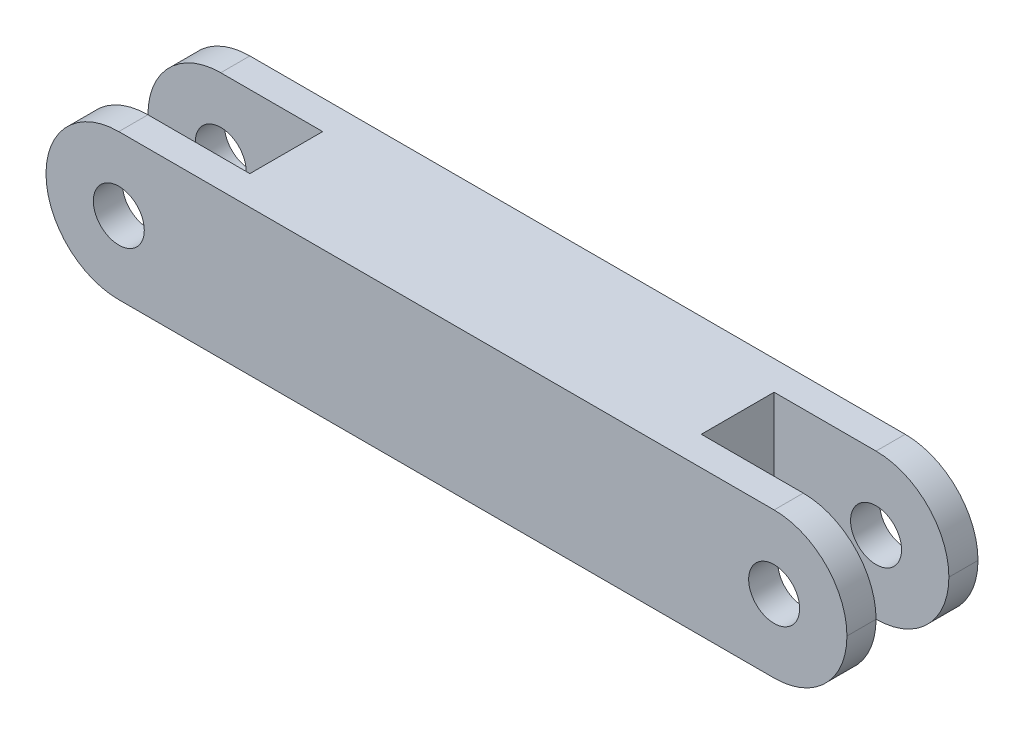
ISO-10303-21;
HEADER;
FILE_DESCRIPTION(('STEP AP214'),'2;1');
FILE_NAME('part.step','',(''),(''),'','','');
FILE_SCHEMA(('AUTOMOTIVE_DESIGN { 1 0 10303 214 1 1 1 1 }'));
ENDSEC;
DATA;
#1=APPLICATION_CONTEXT('core data for automotive mechanical design processes');
#2=APPLICATION_PROTOCOL_DEFINITION('international standard','automotive_design',2000,#1);
#3=PRODUCT_CONTEXT('',#1,'mechanical');
#4=PRODUCT('Part','Part','',(#3));
#5=PRODUCT_RELATED_PRODUCT_CATEGORY('part','',(#4));
#6=PRODUCT_DEFINITION_FORMATION('','',#4);
#7=PRODUCT_DEFINITION_CONTEXT('part definition',#1,'design');
#8=PRODUCT_DEFINITION('design','',#6,#7);
#9=PRODUCT_DEFINITION_SHAPE('','',#8);
#10=(LENGTH_UNIT() NAMED_UNIT(*) SI_UNIT(.MILLI.,.METRE.));
#11=(NAMED_UNIT(*) PLANE_ANGLE_UNIT() SI_UNIT($,.RADIAN.));
#12=(NAMED_UNIT(*) SI_UNIT($,.STERADIAN.) SOLID_ANGLE_UNIT());
#13=UNCERTAINTY_MEASURE_WITH_UNIT(LENGTH_MEASURE(1.E-05),#10,'distance_accuracy_value','');
#14=(GEOMETRIC_REPRESENTATION_CONTEXT(3) GLOBAL_UNCERTAINTY_ASSIGNED_CONTEXT((#13)) GLOBAL_UNIT_ASSIGNED_CONTEXT((#10,
#11,#12)) REPRESENTATION_CONTEXT('',''));
#15=CARTESIAN_POINT('',(0.,0.,0.));
#16=DIRECTION('',(0.,0.,1.));
#17=DIRECTION('',(1.,0.,0.));
#18=AXIS2_PLACEMENT_3D('',#15,#16,#17);
#19=CARTESIAN_POINT('',(50.,5.,0.));
#20=DIRECTION('',(0.,0.,1.));
#21=DIRECTION('',(1.,0.,0.));
#22=AXIS2_PLACEMENT_3D('',#19,#20,#21);
#23=CYLINDRICAL_SURFACE('',#22,5.);
#24=CARTESIAN_POINT('',(50.,5.,7.));
#25=DIRECTION('',(0.,0.,1.));
#26=DIRECTION('',(1.,0.,0.));
#27=AXIS2_PLACEMENT_3D('',#24,#25,#26);
#28=CIRCLE('',#27,5.);
#29=CARTESIAN_POINT('',(50.,10.,7.));
#30=VERTEX_POINT('',#29);
#31=CARTESIAN_POINT('',(55.,5.,7.));
#32=VERTEX_POINT('',#31);
#33=EDGE_CURVE('E215',#30,#32,#28,.F.);
#34=ORIENTED_EDGE('',*,*,#33,.F.);
#35=DIRECTION('',(0.,0.,-1.));
#36=VECTOR('',#35,1.);
#37=CARTESIAN_POINT('',(50.,10.,0.));
#38=LINE('',#37,#36);
#39=CARTESIAN_POINT('',(50.,10.,9.00000000000001));
#40=VERTEX_POINT('',#39);
#41=EDGE_CURVE('E276',#40,#30,#38,.T.);
#42=ORIENTED_EDGE('',*,*,#41,.F.);
#43=CARTESIAN_POINT('',(50.,5.,9.00000000000001));
#44=DIRECTION('',(0.,0.,-1.));
#45=DIRECTION('',(-1.,0.,0.));
#46=AXIS2_PLACEMENT_3D('',#43,#44,#45);
#47=CIRCLE('',#46,5.);
#48=CARTESIAN_POINT('',(55.,5.,9.00000000000001));
#49=VERTEX_POINT('',#48);
#50=EDGE_CURVE('E267',#49,#40,#47,.F.);
#51=ORIENTED_EDGE('',*,*,#50,.F.);
#52=DIRECTION('',(0.,0.,-1.));
#53=VECTOR('',#52,1.);
#54=CARTESIAN_POINT('',(55.,5.,9.00000000000001));
#55=LINE('',#54,#53);
#56=EDGE_CURVE('E281',#32,#49,#55,.F.);
#57=ORIENTED_EDGE('',*,*,#56,.F.);
#58=EDGE_LOOP('',(#34,#42,#51,#57));
#59=FACE_BOUND('',#58,.T.);
#60=ADVANCED_FACE('F43',(#59),#23,.T.);
#61=CARTESIAN_POINT('',(50.,5.,9.00000000000001));
#62=DIRECTION('',(0.,0.,-1.));
#63=DIRECTION('',(-1.,0.,0.));
#64=AXIS2_PLACEMENT_3D('',#61,#62,#63);
#65=CYLINDRICAL_SURFACE('',#64,5.);
#66=CARTESIAN_POINT('',(50.,5.,7.));
#67=DIRECTION('',(0.,0.,1.));
#68=DIRECTION('',(1.,0.,0.));
#69=AXIS2_PLACEMENT_3D('',#66,#67,#68);
#70=CIRCLE('',#69,5.);
#71=CARTESIAN_POINT('',(50.,0.,7.));
#72=VERTEX_POINT('',#71);
#73=EDGE_CURVE('E213',#32,#72,#70,.F.);
#74=ORIENTED_EDGE('',*,*,#73,.F.);
#75=ORIENTED_EDGE('',*,*,#56,.T.);
#76=CARTESIAN_POINT('',(50.,5.,9.00000000000001));
#77=DIRECTION('',(0.,0.,-1.));
#78=DIRECTION('',(-1.,0.,0.));
#79=AXIS2_PLACEMENT_3D('',#76,#77,#78);
#80=CIRCLE('',#79,5.);
#81=CARTESIAN_POINT('',(50.,0.,9.00000000000001));
#82=VERTEX_POINT('',#81);
#83=EDGE_CURVE('E269',#82,#49,#80,.F.);
#84=ORIENTED_EDGE('',*,*,#83,.F.);
#85=DIRECTION('',(0.,0.,-1.));
#86=VECTOR('',#85,1.);
#87=CARTESIAN_POINT('',(50.,0.,0.));
#88=LINE('',#87,#86);
#89=EDGE_CURVE('E259',#72,#82,#88,.F.);
#90=ORIENTED_EDGE('',*,*,#89,.F.);
#91=EDGE_LOOP('',(#74,#75,#84,#90));
#92=FACE_BOUND('',#91,.T.);
#93=ADVANCED_FACE('F349',(#92),#65,.T.);
#94=CARTESIAN_POINT('',(5.,5.,0.));
#95=DIRECTION('',(0.,0.,-1.));
#96=DIRECTION('',(-1.,0.,0.));
#97=AXIS2_PLACEMENT_3D('',#94,#95,#96);
#98=CYLINDRICAL_SURFACE('',#97,5.);
#99=CARTESIAN_POINT('',(5.,5.,2.));
#100=DIRECTION('',(0.,0.,-1.));
#101=DIRECTION('',(-1.,0.,0.));
#102=AXIS2_PLACEMENT_3D('',#99,#100,#101);
#103=CIRCLE('',#102,5.);
#104=CARTESIAN_POINT('',(5.,10.,2.));
#105=VERTEX_POINT('',#104);
#106=CARTESIAN_POINT('',(0.,5.,2.));
#107=VERTEX_POINT('',#106);
#108=EDGE_CURVE('E201',#105,#107,#103,.F.);
#109=ORIENTED_EDGE('',*,*,#108,.F.);
#110=DIRECTION('',(0.,0.,1.));
#111=VECTOR('',#110,1.);
#112=CARTESIAN_POINT('',(5.,10.,9.00000000000001));
#113=LINE('',#112,#111);
#114=CARTESIAN_POINT('',(5.,10.,0.));
#115=VERTEX_POINT('',#114);
#116=EDGE_CURVE('E273',#115,#105,#113,.T.);
#117=ORIENTED_EDGE('',*,*,#116,.F.);
#118=CARTESIAN_POINT('',(5.,5.,0.));
#119=DIRECTION('',(0.,0.,1.));
#120=DIRECTION('',(1.,0.,0.));
#121=AXIS2_PLACEMENT_3D('',#118,#119,#120);
#122=CIRCLE('',#121,5.);
#123=CARTESIAN_POINT('',(0.,5.,0.));
#124=VERTEX_POINT('',#123);
#125=EDGE_CURVE('E240',#124,#115,#122,.F.);
#126=ORIENTED_EDGE('',*,*,#125,.F.);
#127=DIRECTION('',(0.,0.,1.));
#128=VECTOR('',#127,1.);
#129=CARTESIAN_POINT('',(0.,5.,0.));
#130=LINE('',#129,#128);
#131=EDGE_CURVE('E228',#107,#124,#130,.F.);
#132=ORIENTED_EDGE('',*,*,#131,.F.);
#133=EDGE_LOOP('',(#109,#117,#126,#132));
#134=FACE_BOUND('',#133,.T.);
#135=ADVANCED_FACE('F318',(#134),#98,.T.);
#136=CARTESIAN_POINT('',(5.,5.,0.));
#137=DIRECTION('',(0.,0.,1.));
#138=DIRECTION('',(1.,0.,0.));
#139=AXIS2_PLACEMENT_3D('',#136,#137,#138);
#140=CYLINDRICAL_SURFACE('',#139,5.);
#141=CARTESIAN_POINT('',(5.,5.,2.));
#142=DIRECTION('',(0.,0.,-1.));
#143=DIRECTION('',(-1.,0.,0.));
#144=AXIS2_PLACEMENT_3D('',#141,#142,#143);
#145=CIRCLE('',#144,5.);
#146=CARTESIAN_POINT('',(5.,0.,2.));
#147=VERTEX_POINT('',#146);
#148=EDGE_CURVE('E199',#107,#147,#145,.F.);
#149=ORIENTED_EDGE('',*,*,#148,.F.);
#150=ORIENTED_EDGE('',*,*,#131,.T.);
#151=CARTESIAN_POINT('',(5.,5.,0.));
#152=DIRECTION('',(0.,0.,1.));
#153=DIRECTION('',(1.,0.,0.));
#154=AXIS2_PLACEMENT_3D('',#151,#152,#153);
#155=CIRCLE('',#154,5.);
#156=CARTESIAN_POINT('',(5.,0.,0.));
#157=VERTEX_POINT('',#156);
#158=EDGE_CURVE('E248',#157,#124,#155,.F.);
#159=ORIENTED_EDGE('',*,*,#158,.F.);
#160=DIRECTION('',(0.,0.,1.));
#161=VECTOR('',#160,1.);
#162=CARTESIAN_POINT('',(5.,0.,0.));
#163=LINE('',#162,#161);
#164=EDGE_CURVE('E255',#147,#157,#163,.F.);
#165=ORIENTED_EDGE('',*,*,#164,.F.);
#166=EDGE_LOOP('',(#149,#150,#159,#165));
#167=FACE_BOUND('',#166,.T.);
#168=ADVANCED_FACE('F325',(#167),#140,.T.);
#169=CARTESIAN_POINT('',(50.,5.,-0.000999999999999265));
#170=DIRECTION('',(0.,0.,1.));
#171=DIRECTION('',(1.,0.,0.));
#172=AXIS2_PLACEMENT_3D('',#169,#170,#171);
#173=CYLINDRICAL_SURFACE('',#172,1.75);
#174=CARTESIAN_POINT('',(50.,5.,7.));
#175=DIRECTION('',(0.,0.,1.));
#176=DIRECTION('',(1.,0.,0.));
#177=AXIS2_PLACEMENT_3D('',#174,#175,#176);
#178=CIRCLE('',#177,1.75);
#179=CARTESIAN_POINT('',(51.75,5.,7.));
#180=VERTEX_POINT('',#179);
#181=EDGE_CURVE('E212',#180,#180,#178,.F.);
#182=ORIENTED_EDGE('',*,*,#181,.T.);
#183=EDGE_LOOP('',(#182));
#184=FACE_BOUND('',#183,.T.);
#185=CARTESIAN_POINT('',(50.,5.,9.00000000000001));
#186=DIRECTION('',(0.,0.,1.));
#187=DIRECTION('',(1.,0.,0.));
#188=AXIS2_PLACEMENT_3D('',#185,#186,#187);
#189=CIRCLE('',#188,1.75);
#190=CARTESIAN_POINT('',(51.75,5.,9.00000000000001));
#191=VERTEX_POINT('',#190);
#192=EDGE_CURVE('E220',#191,#191,#189,.T.);
#193=ORIENTED_EDGE('',*,*,#192,.T.);
#194=EDGE_LOOP('',(#193));
#195=FACE_BOUND('',#194,.T.);
#196=ADVANCED_FACE('F377',(#184,#195),#173,.F.);
#197=CARTESIAN_POINT('',(5.,5.,-0.000999999999999265));
#198=DIRECTION('',(0.,0.,1.));
#199=DIRECTION('',(1.,0.,0.));
#200=AXIS2_PLACEMENT_3D('',#197,#198,#199);
#201=CYLINDRICAL_SURFACE('',#200,1.75);
#202=CARTESIAN_POINT('',(5.,5.,2.));
#203=DIRECTION('',(0.,0.,-1.));
#204=DIRECTION('',(-1.,0.,0.));
#205=AXIS2_PLACEMENT_3D('',#202,#203,#204);
#206=CIRCLE('',#205,1.75);
#207=CARTESIAN_POINT('',(3.25,5.,2.));
#208=VERTEX_POINT('',#207);
#209=EDGE_CURVE('E198',#208,#208,#206,.F.);
#210=ORIENTED_EDGE('',*,*,#209,.T.);
#211=EDGE_LOOP('',(#210));
#212=FACE_BOUND('',#211,.T.);
#213=CARTESIAN_POINT('',(5.,5.,0.));
#214=DIRECTION('',(0.,0.,1.));
#215=DIRECTION('',(1.,0.,0.));
#216=AXIS2_PLACEMENT_3D('',#213,#214,#215);
#217=CIRCLE('',#216,1.75);
#218=CARTESIAN_POINT('',(6.75,5.,0.));
#219=VERTEX_POINT('',#218);
#220=EDGE_CURVE('E224',#219,#219,#217,.F.);
#221=ORIENTED_EDGE('',*,*,#220,.T.);
#222=EDGE_LOOP('',(#221));
#223=FACE_BOUND('',#222,.T.);
#224=ADVANCED_FACE('F382',(#212,#223),#201,.F.);
#225=CARTESIAN_POINT('',(55.,10.,0.));
#226=DIRECTION('',(0.,0.,1.));
#227=DIRECTION('',(1.,0.,0.));
#228=AXIS2_PLACEMENT_3D('',#225,#226,#227);
#229=PLANE('',#228);
#230=ORIENTED_EDGE('',*,*,#220,.F.);
#231=EDGE_LOOP('',(#230));
#232=FACE_BOUND('',#231,.T.);
#233=CARTESIAN_POINT('',(50.,5.,0.));
#234=DIRECTION('',(0.,0.,1.));
#235=DIRECTION('',(1.,0.,0.));
#236=AXIS2_PLACEMENT_3D('',#233,#234,#235);
#237=CIRCLE('',#236,1.75);
#238=CARTESIAN_POINT('',(51.75,5.,0.));
#239=VERTEX_POINT('',#238);
#240=EDGE_CURVE('E225',#239,#239,#237,.F.);
#241=ORIENTED_EDGE('',*,*,#240,.F.);
#242=EDGE_LOOP('',(#241));
#243=FACE_BOUND('',#242,.T.);
#244=CARTESIAN_POINT('',(50.,5.,0.));
#245=DIRECTION('',(0.,0.,1.));
#246=DIRECTION('',(1.,0.,0.));
#247=AXIS2_PLACEMENT_3D('',#244,#245,#246);
#248=CIRCLE('',#247,5.);
#249=CARTESIAN_POINT('',(50.,10.,0.));
#250=VERTEX_POINT('',#249);
#251=CARTESIAN_POINT('',(55.,5.,0.));
#252=VERTEX_POINT('',#251);
#253=EDGE_CURVE('E251',#250,#252,#248,.F.);
#254=ORIENTED_EDGE('',*,*,#253,.T.);
#255=CARTESIAN_POINT('',(50.,5.,0.));
#256=DIRECTION('',(0.,0.,1.));
#257=DIRECTION('',(1.,0.,0.));
#258=AXIS2_PLACEMENT_3D('',#255,#256,#257);
#259=CIRCLE('',#258,5.);
#260=CARTESIAN_POINT('',(50.,0.,0.));
#261=VERTEX_POINT('',#260);
#262=EDGE_CURVE('E253',#252,#261,#259,.F.);
#263=ORIENTED_EDGE('',*,*,#262,.T.);
#264=DIRECTION('',(-1.,0.,0.));
#265=VECTOR('',#264,1.);
#266=CARTESIAN_POINT('',(55.,0.,0.));
#267=LINE('',#266,#265);
#268=EDGE_CURVE('E241',#261,#157,#267,.T.);
#269=ORIENTED_EDGE('',*,*,#268,.T.);
#270=ORIENTED_EDGE('',*,*,#158,.T.);
#271=ORIENTED_EDGE('',*,*,#125,.T.);
#272=DIRECTION('',(-1.,0.,0.));
#273=VECTOR('',#272,1.);
#274=CARTESIAN_POINT('',(55.,10.,0.));
#275=LINE('',#274,#273);
#276=EDGE_CURVE('E233',#250,#115,#275,.T.);
#277=ORIENTED_EDGE('',*,*,#276,.F.);
#278=EDGE_LOOP('',(#254,#263,#269,#270,#271,#277));
#279=FACE_BOUND('',#278,.T.);
#280=ADVANCED_FACE('F312',(#232,#243,#279),#229,.F.);
#281=CARTESIAN_POINT('',(0.,10.,9.00000000000001));
#282=DIRECTION('',(0.,0.,-1.));
#283=DIRECTION('',(-1.,0.,0.));
#284=AXIS2_PLACEMENT_3D('',#281,#282,#283);
#285=PLANE('',#284);
#286=CARTESIAN_POINT('',(5.,5.,9.00000000000001));
#287=DIRECTION('',(0.,0.,1.));
#288=DIRECTION('',(1.,0.,0.));
#289=AXIS2_PLACEMENT_3D('',#286,#287,#288);
#290=CIRCLE('',#289,1.75);
#291=CARTESIAN_POINT('',(6.75,5.,9.00000000000001));
#292=VERTEX_POINT('',#291);
#293=EDGE_CURVE('E221',#292,#292,#290,.T.);
#294=ORIENTED_EDGE('',*,*,#293,.F.);
#295=EDGE_LOOP('',(#294));
#296=FACE_BOUND('',#295,.T.);
#297=ORIENTED_EDGE('',*,*,#192,.F.);
#298=EDGE_LOOP('',(#297));
#299=FACE_BOUND('',#298,.T.);
#300=DIRECTION('',(1.,0.,0.));
#301=VECTOR('',#300,1.);
#302=CARTESIAN_POINT('',(0.,0.,9.00000000000001));
#303=LINE('',#302,#301);
#304=CARTESIAN_POINT('',(5.,0.,9.00000000000001));
#305=VERTEX_POINT('',#304);
#306=EDGE_CURVE('E237',#305,#82,#303,.T.);
#307=ORIENTED_EDGE('',*,*,#306,.T.);
#308=ORIENTED_EDGE('',*,*,#83,.T.);
#309=ORIENTED_EDGE('',*,*,#50,.T.);
#310=DIRECTION('',(1.,0.,0.));
#311=VECTOR('',#310,1.);
#312=CARTESIAN_POINT('',(0.,10.,9.00000000000001));
#313=LINE('',#312,#311);
#314=CARTESIAN_POINT('',(5.,10.,9.00000000000001));
#315=VERTEX_POINT('',#314);
#316=EDGE_CURVE('E236',#315,#40,#313,.T.);
#317=ORIENTED_EDGE('',*,*,#316,.F.);
#318=CARTESIAN_POINT('',(5.,5.,9.00000000000001));
#319=DIRECTION('',(0.,0.,-1.));
#320=DIRECTION('',(-1.,0.,0.));
#321=AXIS2_PLACEMENT_3D('',#318,#319,#320);
#322=CIRCLE('',#321,5.);
#323=CARTESIAN_POINT('',(0.,5.,9.00000000000001));
#324=VERTEX_POINT('',#323);
#325=EDGE_CURVE('E263',#315,#324,#322,.F.);
#326=ORIENTED_EDGE('',*,*,#325,.T.);
#327=CARTESIAN_POINT('',(5.,5.,9.00000000000001));
#328=DIRECTION('',(0.,0.,-1.));
#329=DIRECTION('',(-1.,0.,0.));
#330=AXIS2_PLACEMENT_3D('',#327,#328,#329);
#331=CIRCLE('',#330,5.);
#332=EDGE_CURVE('E265',#324,#305,#331,.F.);
#333=ORIENTED_EDGE('',*,*,#332,.T.);
#334=EDGE_LOOP('',(#307,#308,#309,#317,#326,#333));
#335=FACE_BOUND('',#334,.T.);
#336=ADVANCED_FACE('F339',(#296,#299,#335),#285,.F.);
#337=CARTESIAN_POINT('',(0.,10.,0.));
#338=DIRECTION('',(0.,1.,0.));
#339=DIRECTION('',(0.,0.,1.));
#340=AXIS2_PLACEMENT_3D('',#337,#338,#339);
#341=PLANE('',#340);
#342=DIRECTION('',(-1.,0.,0.));
#343=VECTOR('',#342,1.);
#344=CARTESIAN_POINT('',(12.,10.,2.));
#345=LINE('',#344,#343);
#346=CARTESIAN_POINT('',(12.,10.,2.));
#347=VERTEX_POINT('',#346);
#348=EDGE_CURVE('E174',#347,#105,#345,.T.);
#349=ORIENTED_EDGE('',*,*,#348,.F.);
#350=DIRECTION('',(0.,0.,-1.));
#351=VECTOR('',#350,1.);
#352=CARTESIAN_POINT('',(12.,10.,7.));
#353=LINE('',#352,#351);
#354=CARTESIAN_POINT('',(12.,10.,7.));
#355=VERTEX_POINT('',#354);
#356=EDGE_CURVE('E165',#355,#347,#353,.T.);
#357=ORIENTED_EDGE('',*,*,#356,.F.);
#358=DIRECTION('',(1.,0.,0.));
#359=VECTOR('',#358,1.);
#360=CARTESIAN_POINT('',(12.,10.,7.));
#361=LINE('',#360,#359);
#362=CARTESIAN_POINT('',(5.,10.,7.));
#363=VERTEX_POINT('',#362);
#364=EDGE_CURVE('E156',#363,#355,#361,.T.);
#365=ORIENTED_EDGE('',*,*,#364,.F.);
#366=EDGE_CURVE('E272',#363,#315,#113,.T.);
#367=ORIENTED_EDGE('',*,*,#366,.T.);
#368=ORIENTED_EDGE('',*,*,#316,.T.);
#369=ORIENTED_EDGE('',*,*,#41,.T.);
#370=DIRECTION('',(1.,0.,0.));
#371=VECTOR('',#370,1.);
#372=CARTESIAN_POINT('',(43.,10.,7.));
#373=LINE('',#372,#371);
#374=CARTESIAN_POINT('',(43.,10.,7.));
#375=VERTEX_POINT('',#374);
#376=EDGE_CURVE('E186',#375,#30,#373,.T.);
#377=ORIENTED_EDGE('',*,*,#376,.F.);
#378=DIRECTION('',(0.,0.,1.));
#379=VECTOR('',#378,1.);
#380=CARTESIAN_POINT('',(43.,10.,7.));
#381=LINE('',#380,#379);
#382=CARTESIAN_POINT('',(43.,10.,2.));
#383=VERTEX_POINT('',#382);
#384=EDGE_CURVE('E190',#383,#375,#381,.T.);
#385=ORIENTED_EDGE('',*,*,#384,.F.);
#386=DIRECTION('',(-1.,0.,0.));
#387=VECTOR('',#386,1.);
#388=CARTESIAN_POINT('',(43.,10.,2.));
#389=LINE('',#388,#387);
#390=CARTESIAN_POINT('',(50.,10.,2.));
#391=VERTEX_POINT('',#390);
#392=EDGE_CURVE('E166',#391,#383,#389,.T.);
#393=ORIENTED_EDGE('',*,*,#392,.F.);
#394=EDGE_CURVE('E275',#391,#250,#38,.T.);
#395=ORIENTED_EDGE('',*,*,#394,.T.);
#396=ORIENTED_EDGE('',*,*,#276,.T.);
#397=ORIENTED_EDGE('',*,*,#116,.T.);
#398=EDGE_LOOP('',(#349,#357,#365,#367,#368,#369,#377,#385,#393,#395,#396,#397));
#399=FACE_BOUND('',#398,.T.);
#400=ADVANCED_FACE('F176',(#399),#341,.T.);
#401=CARTESIAN_POINT('',(0.,0.,0.));
#402=DIRECTION('',(0.,1.,0.));
#403=DIRECTION('',(0.,0.,1.));
#404=AXIS2_PLACEMENT_3D('',#401,#402,#403);
#405=PLANE('',#404);
#406=DIRECTION('',(0.,0.,-1.));
#407=VECTOR('',#406,1.);
#408=CARTESIAN_POINT('',(12.,0.,0.));
#409=LINE('',#408,#407);
#410=CARTESIAN_POINT('',(12.,0.,7.));
#411=VERTEX_POINT('',#410);
#412=CARTESIAN_POINT('',(12.,0.,2.));
#413=VERTEX_POINT('',#412);
#414=EDGE_CURVE('E11',#411,#413,#409,.T.);
#415=ORIENTED_EDGE('',*,*,#414,.T.);
#416=DIRECTION('',(-1.,0.,0.));
#417=VECTOR('',#416,1.);
#418=CARTESIAN_POINT('',(0.,0.,2.));
#419=LINE('',#418,#417);
#420=EDGE_CURVE('E203',#413,#147,#419,.T.);
#421=ORIENTED_EDGE('',*,*,#420,.T.);
#422=ORIENTED_EDGE('',*,*,#164,.T.);
#423=ORIENTED_EDGE('',*,*,#268,.F.);
#424=CARTESIAN_POINT('',(50.,0.,2.));
#425=VERTEX_POINT('',#424);
#426=EDGE_CURVE('E260',#261,#425,#88,.F.);
#427=ORIENTED_EDGE('',*,*,#426,.T.);
#428=DIRECTION('',(-1.,0.,0.));
#429=VECTOR('',#428,1.);
#430=CARTESIAN_POINT('',(0.,0.,2.));
#431=LINE('',#430,#429);
#432=CARTESIAN_POINT('',(43.,0.,2.));
#433=VERTEX_POINT('',#432);
#434=EDGE_CURVE('E58',#425,#433,#431,.T.);
#435=ORIENTED_EDGE('',*,*,#434,.T.);
#436=DIRECTION('',(0.,0.,1.));
#437=VECTOR('',#436,1.);
#438=CARTESIAN_POINT('',(43.,0.,0.));
#439=LINE('',#438,#437);
#440=CARTESIAN_POINT('',(43.,0.,7.));
#441=VERTEX_POINT('',#440);
#442=EDGE_CURVE('E51',#433,#441,#439,.T.);
#443=ORIENTED_EDGE('',*,*,#442,.T.);
#444=DIRECTION('',(1.,0.,0.));
#445=VECTOR('',#444,1.);
#446=CARTESIAN_POINT('',(0.,0.,7.));
#447=LINE('',#446,#445);
#448=EDGE_CURVE('E217',#441,#72,#447,.T.);
#449=ORIENTED_EDGE('',*,*,#448,.T.);
#450=ORIENTED_EDGE('',*,*,#89,.T.);
#451=ORIENTED_EDGE('',*,*,#306,.F.);
#452=CARTESIAN_POINT('',(5.,0.,7.));
#453=VERTEX_POINT('',#452);
#454=EDGE_CURVE('E256',#305,#453,#163,.F.);
#455=ORIENTED_EDGE('',*,*,#454,.T.);
#456=DIRECTION('',(1.,0.,0.));
#457=VECTOR('',#456,1.);
#458=CARTESIAN_POINT('',(0.,0.,7.));
#459=LINE('',#458,#457);
#460=EDGE_CURVE('E66',#453,#411,#459,.T.);
#461=ORIENTED_EDGE('',*,*,#460,.T.);
#462=EDGE_LOOP('',(#415,#421,#422,#423,#427,#435,#443,#449,#450,#451,#455,#461));
#463=FACE_BOUND('',#462,.T.);
#464=ADVANCED_FACE('F294',(#463),#405,.F.);
#465=CARTESIAN_POINT('',(50.,5.,2.));
#466=DIRECTION('',(0.,0.,-1.));
#467=DIRECTION('',(-1.,0.,0.));
#468=AXIS2_PLACEMENT_3D('',#465,#466,#467);
#469=CIRCLE('',#468,5.);
#470=CARTESIAN_POINT('',(55.,5.,2.));
#471=VERTEX_POINT('',#470);
#472=EDGE_CURVE('E209',#471,#391,#469,.F.);
#473=ORIENTED_EDGE('',*,*,#472,.F.);
#474=EDGE_CURVE('E244',#252,#471,#55,.F.);
#475=ORIENTED_EDGE('',*,*,#474,.F.);
#476=ORIENTED_EDGE('',*,*,#253,.F.);
#477=ORIENTED_EDGE('',*,*,#394,.F.);
#478=EDGE_LOOP('',(#473,#475,#476,#477));
#479=FACE_BOUND('',#478,.T.);
#480=ADVANCED_FACE('F308',(#479),#23,.T.);
#481=CARTESIAN_POINT('',(50.,5.,2.));
#482=DIRECTION('',(0.,0.,-1.));
#483=DIRECTION('',(-1.,0.,0.));
#484=AXIS2_PLACEMENT_3D('',#481,#482,#483);
#485=CIRCLE('',#484,5.);
#486=EDGE_CURVE('E207',#425,#471,#485,.F.);
#487=ORIENTED_EDGE('',*,*,#486,.F.);
#488=ORIENTED_EDGE('',*,*,#426,.F.);
#489=ORIENTED_EDGE('',*,*,#262,.F.);
#490=ORIENTED_EDGE('',*,*,#474,.T.);
#491=EDGE_LOOP('',(#487,#488,#489,#490));
#492=FACE_BOUND('',#491,.T.);
#493=ADVANCED_FACE('F352',(#492),#65,.T.);
#494=CARTESIAN_POINT('',(5.,5.,7.));
#495=DIRECTION('',(0.,0.,1.));
#496=DIRECTION('',(1.,0.,0.));
#497=AXIS2_PLACEMENT_3D('',#494,#495,#496);
#498=CIRCLE('',#497,5.);
#499=CARTESIAN_POINT('',(0.,5.,7.));
#500=VERTEX_POINT('',#499);
#501=EDGE_CURVE('E161',#500,#363,#498,.F.);
#502=ORIENTED_EDGE('',*,*,#501,.F.);
#503=EDGE_CURVE('E282',#324,#500,#130,.F.);
#504=ORIENTED_EDGE('',*,*,#503,.F.);
#505=ORIENTED_EDGE('',*,*,#325,.F.);
#506=ORIENTED_EDGE('',*,*,#366,.F.);
#507=EDGE_LOOP('',(#502,#504,#505,#506));
#508=FACE_BOUND('',#507,.T.);
#509=ADVANCED_FACE('F45',(#508),#98,.T.);
#510=CARTESIAN_POINT('',(5.,5.,7.));
#511=DIRECTION('',(0.,0.,1.));
#512=DIRECTION('',(1.,0.,0.));
#513=AXIS2_PLACEMENT_3D('',#510,#511,#512);
#514=CIRCLE('',#513,5.);
#515=EDGE_CURVE('E194',#453,#500,#514,.F.);
#516=ORIENTED_EDGE('',*,*,#515,.F.);
#517=ORIENTED_EDGE('',*,*,#454,.F.);
#518=ORIENTED_EDGE('',*,*,#332,.F.);
#519=ORIENTED_EDGE('',*,*,#503,.T.);
#520=EDGE_LOOP('',(#516,#517,#518,#519));
#521=FACE_BOUND('',#520,.T.);
#522=ADVANCED_FACE('F332',(#521),#140,.T.);
#523=CARTESIAN_POINT('',(50.,5.,2.));
#524=DIRECTION('',(0.,0.,-1.));
#525=DIRECTION('',(-1.,0.,0.));
#526=AXIS2_PLACEMENT_3D('',#523,#524,#525);
#527=CIRCLE('',#526,1.75);
#528=CARTESIAN_POINT('',(48.25,5.,2.));
#529=VERTEX_POINT('',#528);
#530=EDGE_CURVE('E206',#529,#529,#527,.F.);
#531=ORIENTED_EDGE('',*,*,#530,.T.);
#532=EDGE_LOOP('',(#531));
#533=FACE_BOUND('',#532,.T.);
#534=ORIENTED_EDGE('',*,*,#240,.T.);
#535=EDGE_LOOP('',(#534));
#536=FACE_BOUND('',#535,.T.);
#537=ADVANCED_FACE('F370',(#533,#536),#173,.F.);
#538=CARTESIAN_POINT('',(5.,5.,7.));
#539=DIRECTION('',(0.,0.,1.));
#540=DIRECTION('',(1.,0.,0.));
#541=AXIS2_PLACEMENT_3D('',#538,#539,#540);
#542=CIRCLE('',#541,1.75);
#543=CARTESIAN_POINT('',(6.75,5.,7.));
#544=VERTEX_POINT('',#543);
#545=EDGE_CURVE('E181',#544,#544,#542,.F.);
#546=ORIENTED_EDGE('',*,*,#545,.T.);
#547=EDGE_LOOP('',(#546));
#548=FACE_BOUND('',#547,.T.);
#549=ORIENTED_EDGE('',*,*,#293,.T.);
#550=EDGE_LOOP('',(#549));
#551=FACE_BOUND('',#550,.T.);
#552=ADVANCED_FACE('F374',(#548,#551),#201,.F.);
#553=CARTESIAN_POINT('',(12.,-1.2E-05,7.));
#554=DIRECTION('',(1.,0.,0.));
#555=DIRECTION('',(0.,0.,-1.));
#556=AXIS2_PLACEMENT_3D('',#553,#554,#555);
#557=PLANE('',#556);
#558=DIRECTION('',(0.,1.,0.));
#559=VECTOR('',#558,1.);
#560=CARTESIAN_POINT('',(12.,-1.2E-05,7.));
#561=LINE('',#560,#559);
#562=EDGE_CURVE('E159',#411,#355,#561,.T.);
#563=ORIENTED_EDGE('',*,*,#562,.T.);
#564=ORIENTED_EDGE('',*,*,#356,.T.);
#565=DIRECTION('',(0.,1.,0.));
#566=VECTOR('',#565,1.);
#567=CARTESIAN_POINT('',(12.,-1.2E-05,2.));
#568=LINE('',#567,#566);
#569=EDGE_CURVE('E173',#413,#347,#568,.T.);
#570=ORIENTED_EDGE('',*,*,#569,.F.);
#571=ORIENTED_EDGE('',*,*,#414,.F.);
#572=EDGE_LOOP('',(#563,#564,#570,#571));
#573=FACE_BOUND('',#572,.T.);
#574=ADVANCED_FACE('F170',(#573),#557,.F.);
#575=CARTESIAN_POINT('',(12.,-1.2E-05,2.));
#576=DIRECTION('',(0.,0.,-1.));
#577=DIRECTION('',(-1.,0.,0.));
#578=AXIS2_PLACEMENT_3D('',#575,#576,#577);
#579=PLANE('',#578);
#580=ORIENTED_EDGE('',*,*,#209,.F.);
#581=EDGE_LOOP('',(#580));
#582=FACE_BOUND('',#581,.T.);
#583=ORIENTED_EDGE('',*,*,#569,.T.);
#584=ORIENTED_EDGE('',*,*,#348,.T.);
#585=ORIENTED_EDGE('',*,*,#108,.T.);
#586=ORIENTED_EDGE('',*,*,#148,.T.);
#587=ORIENTED_EDGE('',*,*,#420,.F.);
#588=EDGE_LOOP('',(#583,#584,#585,#586,#587));
#589=FACE_BOUND('',#588,.T.);
#590=ADVANCED_FACE('F322',(#582,#589),#579,.F.);
#591=CARTESIAN_POINT('',(12.,-1.2E-05,7.));
#592=DIRECTION('',(0.,0.,1.));
#593=DIRECTION('',(1.,0.,0.));
#594=AXIS2_PLACEMENT_3D('',#591,#592,#593);
#595=PLANE('',#594);
#596=ORIENTED_EDGE('',*,*,#545,.F.);
#597=EDGE_LOOP('',(#596));
#598=FACE_BOUND('',#597,.T.);
#599=ORIENTED_EDGE('',*,*,#515,.T.);
#600=ORIENTED_EDGE('',*,*,#501,.T.);
#601=ORIENTED_EDGE('',*,*,#364,.T.);
#602=ORIENTED_EDGE('',*,*,#562,.F.);
#603=ORIENTED_EDGE('',*,*,#460,.F.);
#604=EDGE_LOOP('',(#599,#600,#601,#602,#603));
#605=FACE_BOUND('',#604,.T.);
#606=ADVANCED_FACE('F158',(#598,#605),#595,.F.);
#607=CARTESIAN_POINT('',(43.,-1.2E-05,7.));
#608=DIRECTION('',(-1.,0.,0.));
#609=DIRECTION('',(0.,0.,1.));
#610=AXIS2_PLACEMENT_3D('',#607,#608,#609);
#611=PLANE('',#610);
#612=DIRECTION('',(0.,1.,0.));
#613=VECTOR('',#612,1.);
#614=CARTESIAN_POINT('',(43.,-1.2E-05,2.));
#615=LINE('',#614,#613);
#616=EDGE_CURVE('E183',#433,#383,#615,.T.);
#617=ORIENTED_EDGE('',*,*,#616,.T.);
#618=ORIENTED_EDGE('',*,*,#384,.T.);
#619=DIRECTION('',(0.,1.,0.));
#620=VECTOR('',#619,1.);
#621=CARTESIAN_POINT('',(43.,-1.2E-05,7.));
#622=LINE('',#621,#620);
#623=EDGE_CURVE('E187',#441,#375,#622,.T.);
#624=ORIENTED_EDGE('',*,*,#623,.F.);
#625=ORIENTED_EDGE('',*,*,#442,.F.);
#626=EDGE_LOOP('',(#617,#618,#624,#625));
#627=FACE_BOUND('',#626,.T.);
#628=ADVANCED_FACE('F298',(#627),#611,.F.);
#629=CARTESIAN_POINT('',(43.,-1.2E-05,7.));
#630=DIRECTION('',(0.,0.,1.));
#631=DIRECTION('',(1.,0.,0.));
#632=AXIS2_PLACEMENT_3D('',#629,#630,#631);
#633=PLANE('',#632);
#634=ORIENTED_EDGE('',*,*,#181,.F.);
#635=EDGE_LOOP('',(#634));
#636=FACE_BOUND('',#635,.T.);
#637=ORIENTED_EDGE('',*,*,#623,.T.);
#638=ORIENTED_EDGE('',*,*,#376,.T.);
#639=ORIENTED_EDGE('',*,*,#33,.T.);
#640=ORIENTED_EDGE('',*,*,#73,.T.);
#641=ORIENTED_EDGE('',*,*,#448,.F.);
#642=EDGE_LOOP('',(#637,#638,#639,#640,#641));
#643=FACE_BOUND('',#642,.T.);
#644=ADVANCED_FACE('F346',(#636,#643),#633,.F.);
#645=CARTESIAN_POINT('',(43.,-1.2E-05,2.));
#646=DIRECTION('',(0.,0.,-1.));
#647=DIRECTION('',(-1.,0.,0.));
#648=AXIS2_PLACEMENT_3D('',#645,#646,#647);
#649=PLANE('',#648);
#650=ORIENTED_EDGE('',*,*,#530,.F.);
#651=EDGE_LOOP('',(#650));
#652=FACE_BOUND('',#651,.T.);
#653=ORIENTED_EDGE('',*,*,#486,.T.);
#654=ORIENTED_EDGE('',*,*,#472,.T.);
#655=ORIENTED_EDGE('',*,*,#392,.T.);
#656=ORIENTED_EDGE('',*,*,#616,.F.);
#657=ORIENTED_EDGE('',*,*,#434,.F.);
#658=EDGE_LOOP('',(#653,#654,#655,#656,#657));
#659=FACE_BOUND('',#658,.T.);
#660=ADVANCED_FACE('F300',(#652,#659),#649,.F.);
#661=CLOSED_SHELL('',(#60,#93,#135,#168,#196,#224,#280,#336,#400,#464,#480,#493,#509,#522,#537,
#552,#574,#590,#606,#628,#644,#660));
#662=MANIFOLD_SOLID_BREP('B2',#661);
#663=ADVANCED_BREP_SHAPE_REPRESENTATION('',(#18,#662),#14);
#664=SHAPE_DEFINITION_REPRESENTATION(#9,#663);
ENDSEC;
END-ISO-10303-21;
